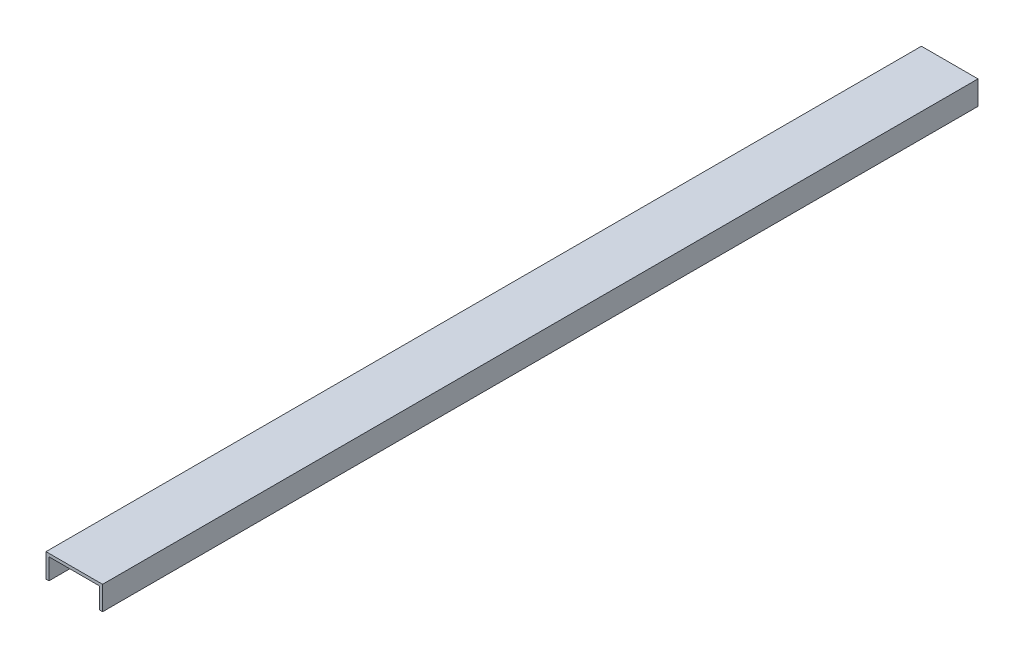
ISO-10303-21;
HEADER;
FILE_DESCRIPTION(('STEP AP214'),'2;1');
FILE_NAME('part.step','',(''),(''),'','','');
FILE_SCHEMA(('AUTOMOTIVE_DESIGN { 1 0 10303 214 1 1 1 1 }'));
ENDSEC;
DATA;
#1=APPLICATION_CONTEXT('core data for automotive mechanical design processes');
#2=APPLICATION_PROTOCOL_DEFINITION('international standard','automotive_design',2000,#1);
#3=PRODUCT_CONTEXT('',#1,'mechanical');
#4=PRODUCT('Part','Part','',(#3));
#5=PRODUCT_RELATED_PRODUCT_CATEGORY('part','',(#4));
#6=PRODUCT_DEFINITION_FORMATION('','',#4);
#7=PRODUCT_DEFINITION_CONTEXT('part definition',#1,'design');
#8=PRODUCT_DEFINITION('design','',#6,#7);
#9=PRODUCT_DEFINITION_SHAPE('','',#8);
#10=(LENGTH_UNIT() NAMED_UNIT(*) SI_UNIT(.MILLI.,.METRE.));
#11=(NAMED_UNIT(*) PLANE_ANGLE_UNIT() SI_UNIT($,.RADIAN.));
#12=(NAMED_UNIT(*) SI_UNIT($,.STERADIAN.) SOLID_ANGLE_UNIT());
#13=UNCERTAINTY_MEASURE_WITH_UNIT(LENGTH_MEASURE(1.E-05),#10,'distance_accuracy_value','');
#14=(GEOMETRIC_REPRESENTATION_CONTEXT(3) GLOBAL_UNCERTAINTY_ASSIGNED_CONTEXT((#13)) GLOBAL_UNIT_ASSIGNED_CONTEXT((#10,
#11,#12)) REPRESENTATION_CONTEXT('',''));
#15=CARTESIAN_POINT('',(0.,0.,0.));
#16=DIRECTION('',(0.,0.,1.));
#17=DIRECTION('',(1.,0.,0.));
#18=AXIS2_PLACEMENT_3D('',#15,#16,#17);
#19=CARTESIAN_POINT('',(8.5,-7.,294.));
#20=DIRECTION('',(1.,0.,0.));
#21=DIRECTION('',(0.,0.,-1.));
#22=AXIS2_PLACEMENT_3D('',#19,#20,#21);
#23=PLANE('',#22);
#24=DIRECTION('',(0.,-1.,0.));
#25=VECTOR('',#24,1.);
#26=CARTESIAN_POINT('',(8.5,-7.,0.));
#27=LINE('',#26,#25);
#28=CARTESIAN_POINT('',(8.5,0.,0.));
#29=VERTEX_POINT('',#28);
#30=CARTESIAN_POINT('',(8.5,-7.,0.));
#31=VERTEX_POINT('',#30);
#32=EDGE_CURVE('E132',#29,#31,#27,.T.);
#33=ORIENTED_EDGE('',*,*,#32,.T.);
#34=DIRECTION('',(0.,0.,-1.));
#35=VECTOR('',#34,1.);
#36=CARTESIAN_POINT('',(8.5,-7.,294.));
#37=LINE('',#36,#35);
#38=CARTESIAN_POINT('',(8.5,-7.,294.));
#39=VERTEX_POINT('',#38);
#40=EDGE_CURVE('E40',#39,#31,#37,.T.);
#41=ORIENTED_EDGE('',*,*,#40,.F.);
#42=DIRECTION('',(0.,-1.,0.));
#43=VECTOR('',#42,1.);
#44=CARTESIAN_POINT('',(8.5,-7.,294.));
#45=LINE('',#44,#43);
#46=CARTESIAN_POINT('',(8.5,0.,294.));
#47=VERTEX_POINT('',#46);
#48=EDGE_CURVE('E92',#47,#39,#45,.T.);
#49=ORIENTED_EDGE('',*,*,#48,.F.);
#50=DIRECTION('',(0.,0.,-1.));
#51=VECTOR('',#50,1.);
#52=CARTESIAN_POINT('',(8.5,0.,294.));
#53=LINE('',#52,#51);
#54=EDGE_CURVE('E11',#47,#29,#53,.T.);
#55=ORIENTED_EDGE('',*,*,#54,.T.);
#56=EDGE_LOOP('',(#33,#41,#49,#55));
#57=FACE_BOUND('',#56,.T.);
#58=ADVANCED_FACE('F32',(#57),#23,.F.);
#59=CARTESIAN_POINT('',(9.5,-7.,294.));
#60=DIRECTION('',(0.,1.,0.));
#61=DIRECTION('',(0.,0.,1.));
#62=AXIS2_PLACEMENT_3D('',#59,#60,#61);
#63=PLANE('',#62);
#64=DIRECTION('',(1.,0.,0.));
#65=VECTOR('',#64,1.);
#66=CARTESIAN_POINT('',(9.5,-7.,0.));
#67=LINE('',#66,#65);
#68=CARTESIAN_POINT('',(9.5,-7.,0.));
#69=VERTEX_POINT('',#68);
#70=EDGE_CURVE('E134',#31,#69,#67,.T.);
#71=ORIENTED_EDGE('',*,*,#70,.T.);
#72=DIRECTION('',(0.,0.,-1.));
#73=VECTOR('',#72,1.);
#74=CARTESIAN_POINT('',(9.5,-7.,294.));
#75=LINE('',#74,#73);
#76=CARTESIAN_POINT('',(9.5,-7.,294.));
#77=VERTEX_POINT('',#76);
#78=EDGE_CURVE('E151',#77,#69,#75,.T.);
#79=ORIENTED_EDGE('',*,*,#78,.F.);
#80=DIRECTION('',(1.,0.,0.));
#81=VECTOR('',#80,1.);
#82=CARTESIAN_POINT('',(9.5,-7.,294.));
#83=LINE('',#82,#81);
#84=EDGE_CURVE('E159',#39,#77,#83,.T.);
#85=ORIENTED_EDGE('',*,*,#84,.F.);
#86=ORIENTED_EDGE('',*,*,#40,.T.);
#87=EDGE_LOOP('',(#71,#79,#85,#86));
#88=FACE_BOUND('',#87,.T.);
#89=ADVANCED_FACE('F157',(#88),#63,.F.);
#90=CARTESIAN_POINT('',(9.5,0.999999999999999,294.));
#91=DIRECTION('',(-1.,0.,0.));
#92=DIRECTION('',(0.,0.,1.));
#93=AXIS2_PLACEMENT_3D('',#90,#91,#92);
#94=PLANE('',#93);
#95=DIRECTION('',(0.,1.,0.));
#96=VECTOR('',#95,1.);
#97=CARTESIAN_POINT('',(9.5,0.999999999999999,0.));
#98=LINE('',#97,#96);
#99=CARTESIAN_POINT('',(9.5,0.999999999999999,0.));
#100=VERTEX_POINT('',#99);
#101=EDGE_CURVE('E136',#69,#100,#98,.T.);
#102=ORIENTED_EDGE('',*,*,#101,.T.);
#103=DIRECTION('',(0.,0.,-1.));
#104=VECTOR('',#103,1.);
#105=CARTESIAN_POINT('',(9.5,0.999999999999999,294.));
#106=LINE('',#105,#104);
#107=CARTESIAN_POINT('',(9.5,0.999999999999999,294.));
#108=VERTEX_POINT('',#107);
#109=EDGE_CURVE('E148',#108,#100,#106,.T.);
#110=ORIENTED_EDGE('',*,*,#109,.F.);
#111=DIRECTION('',(0.,1.,0.));
#112=VECTOR('',#111,1.);
#113=CARTESIAN_POINT('',(9.5,0.999999999999999,294.));
#114=LINE('',#113,#112);
#115=EDGE_CURVE('E172',#77,#108,#114,.T.);
#116=ORIENTED_EDGE('',*,*,#115,.F.);
#117=ORIENTED_EDGE('',*,*,#78,.T.);
#118=EDGE_LOOP('',(#102,#110,#116,#117));
#119=FACE_BOUND('',#118,.T.);
#120=ADVANCED_FACE('F168',(#119),#94,.F.);
#121=CARTESIAN_POINT('',(-9.5,0.999999999999999,294.));
#122=DIRECTION('',(0.,-1.,0.));
#123=DIRECTION('',(0.,0.,-1.));
#124=AXIS2_PLACEMENT_3D('',#121,#122,#123);
#125=PLANE('',#124);
#126=DIRECTION('',(-1.,0.,0.));
#127=VECTOR('',#126,1.);
#128=CARTESIAN_POINT('',(-9.5,0.999999999999999,0.));
#129=LINE('',#128,#127);
#130=CARTESIAN_POINT('',(-9.5,0.999999999999999,0.));
#131=VERTEX_POINT('',#130);
#132=EDGE_CURVE('E138',#100,#131,#129,.T.);
#133=ORIENTED_EDGE('',*,*,#132,.T.);
#134=DIRECTION('',(0.,0.,-1.));
#135=VECTOR('',#134,1.);
#136=CARTESIAN_POINT('',(-9.5,0.999999999999999,294.));
#137=LINE('',#136,#135);
#138=CARTESIAN_POINT('',(-9.5,0.999999999999999,294.));
#139=VERTEX_POINT('',#138);
#140=EDGE_CURVE('E121',#139,#131,#137,.T.);
#141=ORIENTED_EDGE('',*,*,#140,.F.);
#142=DIRECTION('',(-1.,0.,0.));
#143=VECTOR('',#142,1.);
#144=CARTESIAN_POINT('',(-9.5,0.999999999999999,294.));
#145=LINE('',#144,#143);
#146=EDGE_CURVE('E112',#108,#139,#145,.T.);
#147=ORIENTED_EDGE('',*,*,#146,.F.);
#148=ORIENTED_EDGE('',*,*,#109,.T.);
#149=EDGE_LOOP('',(#133,#141,#147,#148));
#150=FACE_BOUND('',#149,.T.);
#151=ADVANCED_FACE('F171',(#150),#125,.F.);
#152=CARTESIAN_POINT('',(-9.5,-7.,294.));
#153=DIRECTION('',(1.,0.,0.));
#154=DIRECTION('',(0.,0.,-1.));
#155=AXIS2_PLACEMENT_3D('',#152,#153,#154);
#156=PLANE('',#155);
#157=DIRECTION('',(0.,-1.,0.));
#158=VECTOR('',#157,1.);
#159=CARTESIAN_POINT('',(-9.5,-7.,0.));
#160=LINE('',#159,#158);
#161=CARTESIAN_POINT('',(-9.5,-7.,0.));
#162=VERTEX_POINT('',#161);
#163=EDGE_CURVE('E120',#131,#162,#160,.T.);
#164=ORIENTED_EDGE('',*,*,#163,.T.);
#165=DIRECTION('',(0.,0.,-1.));
#166=VECTOR('',#165,1.);
#167=CARTESIAN_POINT('',(-9.5,-7.,294.));
#168=LINE('',#167,#166);
#169=CARTESIAN_POINT('',(-9.5,-7.,294.));
#170=VERTEX_POINT('',#169);
#171=EDGE_CURVE('E117',#170,#162,#168,.T.);
#172=ORIENTED_EDGE('',*,*,#171,.F.);
#173=DIRECTION('',(0.,-1.,0.));
#174=VECTOR('',#173,1.);
#175=CARTESIAN_POINT('',(-9.5,-7.,294.));
#176=LINE('',#175,#174);
#177=EDGE_CURVE('E106',#139,#170,#176,.T.);
#178=ORIENTED_EDGE('',*,*,#177,.F.);
#179=ORIENTED_EDGE('',*,*,#140,.T.);
#180=EDGE_LOOP('',(#164,#172,#178,#179));
#181=FACE_BOUND('',#180,.T.);
#182=ADVANCED_FACE('F118',(#181),#156,.F.);
#183=CARTESIAN_POINT('',(-8.5,-7.,294.));
#184=DIRECTION('',(0.,1.,0.));
#185=DIRECTION('',(0.,0.,1.));
#186=AXIS2_PLACEMENT_3D('',#183,#184,#185);
#187=PLANE('',#186);
#188=DIRECTION('',(1.,0.,0.));
#189=VECTOR('',#188,1.);
#190=CARTESIAN_POINT('',(-8.5,-7.,0.));
#191=LINE('',#190,#189);
#192=CARTESIAN_POINT('',(-8.5,-7.,0.));
#193=VERTEX_POINT('',#192);
#194=EDGE_CURVE('E78',#162,#193,#191,.T.);
#195=ORIENTED_EDGE('',*,*,#194,.T.);
#196=DIRECTION('',(0.,0.,-1.));
#197=VECTOR('',#196,1.);
#198=CARTESIAN_POINT('',(-8.5,-7.,294.));
#199=LINE('',#198,#197);
#200=CARTESIAN_POINT('',(-8.5,-7.,294.));
#201=VERTEX_POINT('',#200);
#202=EDGE_CURVE('E122',#201,#193,#199,.T.);
#203=ORIENTED_EDGE('',*,*,#202,.F.);
#204=DIRECTION('',(1.,0.,0.));
#205=VECTOR('',#204,1.);
#206=CARTESIAN_POINT('',(-8.5,-7.,294.));
#207=LINE('',#206,#205);
#208=EDGE_CURVE('E110',#170,#201,#207,.T.);
#209=ORIENTED_EDGE('',*,*,#208,.F.);
#210=ORIENTED_EDGE('',*,*,#171,.T.);
#211=EDGE_LOOP('',(#195,#203,#209,#210));
#212=FACE_BOUND('',#211,.T.);
#213=ADVANCED_FACE('F124',(#212),#187,.F.);
#214=CARTESIAN_POINT('',(-8.5,0.,294.));
#215=DIRECTION('',(-1.,0.,0.));
#216=DIRECTION('',(0.,0.,1.));
#217=AXIS2_PLACEMENT_3D('',#214,#215,#216);
#218=PLANE('',#217);
#219=DIRECTION('',(0.,1.,0.));
#220=VECTOR('',#219,1.);
#221=CARTESIAN_POINT('',(-8.5,0.,0.));
#222=LINE('',#221,#220);
#223=CARTESIAN_POINT('',(-8.5,0.,0.));
#224=VERTEX_POINT('',#223);
#225=EDGE_CURVE('E85',#193,#224,#222,.T.);
#226=ORIENTED_EDGE('',*,*,#225,.T.);
#227=DIRECTION('',(0.,0.,-1.));
#228=VECTOR('',#227,1.);
#229=CARTESIAN_POINT('',(-8.5,0.,294.));
#230=LINE('',#229,#228);
#231=CARTESIAN_POINT('',(-8.5,0.,294.));
#232=VERTEX_POINT('',#231);
#233=EDGE_CURVE('E128',#232,#224,#230,.T.);
#234=ORIENTED_EDGE('',*,*,#233,.F.);
#235=DIRECTION('',(0.,1.,0.));
#236=VECTOR('',#235,1.);
#237=CARTESIAN_POINT('',(-8.5,0.,294.));
#238=LINE('',#237,#236);
#239=EDGE_CURVE('E126',#201,#232,#238,.T.);
#240=ORIENTED_EDGE('',*,*,#239,.F.);
#241=ORIENTED_EDGE('',*,*,#202,.T.);
#242=EDGE_LOOP('',(#226,#234,#240,#241));
#243=FACE_BOUND('',#242,.T.);
#244=ADVANCED_FACE('F193',(#243),#218,.F.);
#245=CARTESIAN_POINT('',(0.,0.,294.));
#246=DIRECTION('',(0.,1.,0.));
#247=DIRECTION('',(-1.,0.,0.));
#248=AXIS2_PLACEMENT_3D('',#245,#246,#247);
#249=PLANE('',#248);
#250=DIRECTION('',(1.,0.,0.));
#251=VECTOR('',#250,1.);
#252=CARTESIAN_POINT('',(0.,0.,0.));
#253=LINE('',#252,#251);
#254=EDGE_CURVE('E143',#224,#29,#253,.T.);
#255=ORIENTED_EDGE('',*,*,#254,.T.);
#256=ORIENTED_EDGE('',*,*,#54,.F.);
#257=DIRECTION('',(1.,0.,0.));
#258=VECTOR('',#257,1.);
#259=CARTESIAN_POINT('',(8.5,0.,294.));
#260=LINE('',#259,#258);
#261=EDGE_CURVE('E48',#232,#47,#260,.T.);
#262=ORIENTED_EDGE('',*,*,#261,.F.);
#263=ORIENTED_EDGE('',*,*,#233,.T.);
#264=EDGE_LOOP('',(#255,#256,#262,#263));
#265=FACE_BOUND('',#264,.T.);
#266=ADVANCED_FACE('F177',(#265),#249,.F.);
#267=CARTESIAN_POINT('',(0.,0.,294.));
#268=DIRECTION('',(0.,0.,1.));
#269=DIRECTION('',(1.,0.,0.));
#270=AXIS2_PLACEMENT_3D('',#267,#268,#269);
#271=PLANE('',#270);
#272=ORIENTED_EDGE('',*,*,#261,.T.);
#273=ORIENTED_EDGE('',*,*,#48,.T.);
#274=ORIENTED_EDGE('',*,*,#84,.T.);
#275=ORIENTED_EDGE('',*,*,#115,.T.);
#276=ORIENTED_EDGE('',*,*,#146,.T.);
#277=ORIENTED_EDGE('',*,*,#177,.T.);
#278=ORIENTED_EDGE('',*,*,#208,.T.);
#279=ORIENTED_EDGE('',*,*,#239,.T.);
#280=EDGE_LOOP('',(#272,#273,#274,#275,#276,#277,#278,#279));
#281=FACE_BOUND('',#280,.T.);
#282=ADVANCED_FACE('F108',(#281),#271,.T.);
#283=CARTESIAN_POINT('',(0.,0.,0.));
#284=DIRECTION('',(0.,0.,1.));
#285=DIRECTION('',(1.,0.,0.));
#286=AXIS2_PLACEMENT_3D('',#283,#284,#285);
#287=PLANE('',#286);
#288=ORIENTED_EDGE('',*,*,#32,.F.);
#289=ORIENTED_EDGE('',*,*,#254,.F.);
#290=ORIENTED_EDGE('',*,*,#225,.F.);
#291=ORIENTED_EDGE('',*,*,#194,.F.);
#292=ORIENTED_EDGE('',*,*,#163,.F.);
#293=ORIENTED_EDGE('',*,*,#132,.F.);
#294=ORIENTED_EDGE('',*,*,#101,.F.);
#295=ORIENTED_EDGE('',*,*,#70,.F.);
#296=EDGE_LOOP('',(#288,#289,#290,#291,#292,#293,#294,#295));
#297=FACE_BOUND('',#296,.T.);
#298=ADVANCED_FACE('F163',(#297),#287,.F.);
#299=CLOSED_SHELL('',(#58,#89,#120,#151,#182,#213,#244,#266,#282,#298));
#300=MANIFOLD_SOLID_BREP('B2',#299);
#301=ADVANCED_BREP_SHAPE_REPRESENTATION('',(#18,#300),#14);
#302=SHAPE_DEFINITION_REPRESENTATION(#9,#301);
ENDSEC;
END-ISO-10303-21;
